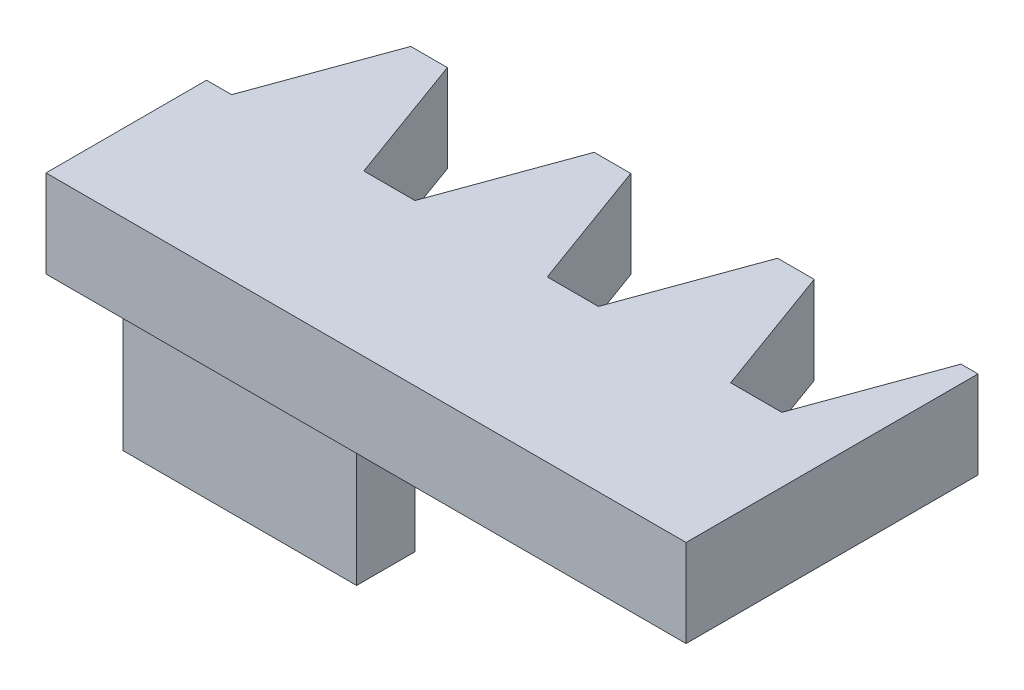
ISO-10303-21;
HEADER;
FILE_DESCRIPTION(('STEP AP214'),'2;1');
FILE_NAME('part.step','',(''),(''),'','','');
FILE_SCHEMA(('AUTOMOTIVE_DESIGN { 1 0 10303 214 1 1 1 1 }'));
ENDSEC;
DATA;
#1=APPLICATION_CONTEXT('core data for automotive mechanical design processes');
#2=APPLICATION_PROTOCOL_DEFINITION('international standard','automotive_design',2000,#1);
#3=PRODUCT_CONTEXT('',#1,'mechanical');
#4=PRODUCT('Part','Part','',(#3));
#5=PRODUCT_RELATED_PRODUCT_CATEGORY('part','',(#4));
#6=PRODUCT_DEFINITION_FORMATION('','',#4);
#7=PRODUCT_DEFINITION_CONTEXT('part definition',#1,'design');
#8=PRODUCT_DEFINITION('design','',#6,#7);
#9=PRODUCT_DEFINITION_SHAPE('','',#8);
#10=(LENGTH_UNIT() NAMED_UNIT(*) SI_UNIT(.MILLI.,.METRE.));
#11=(NAMED_UNIT(*) PLANE_ANGLE_UNIT() SI_UNIT($,.RADIAN.));
#12=(NAMED_UNIT(*) SI_UNIT($,.STERADIAN.) SOLID_ANGLE_UNIT());
#13=UNCERTAINTY_MEASURE_WITH_UNIT(LENGTH_MEASURE(1.E-05),#10,'distance_accuracy_value','');
#14=(GEOMETRIC_REPRESENTATION_CONTEXT(3) GLOBAL_UNCERTAINTY_ASSIGNED_CONTEXT((#13)) GLOBAL_UNIT_ASSIGNED_CONTEXT((#10,
#11,#12)) REPRESENTATION_CONTEXT('',''));
#15=CARTESIAN_POINT('',(0.,0.,0.));
#16=DIRECTION('',(0.,0.,1.));
#17=DIRECTION('',(1.,0.,0.));
#18=AXIS2_PLACEMENT_3D('',#15,#16,#17);
#19=CARTESIAN_POINT('',(0.,12.7,0.));
#20=DIRECTION('',(-1.,0.,0.));
#21=DIRECTION('',(0.,0.,-1.));
#22=AXIS2_PLACEMENT_3D('',#19,#20,#21);
#23=PLANE('',#22);
#24=DIRECTION('',(0.,0.,1.));
#25=VECTOR('',#24,1.);
#26=CARTESIAN_POINT('',(0.,0.,0.));
#27=LINE('',#26,#25);
#28=CARTESIAN_POINT('',(0.,0.,-6.35));
#29=VERTEX_POINT('',#28);
#30=CARTESIAN_POINT('',(0.,0.,0.));
#31=VERTEX_POINT('',#30);
#32=EDGE_CURVE('E334',#29,#31,#27,.T.);
#33=ORIENTED_EDGE('',*,*,#32,.F.);
#34=DIRECTION('',(0.,-1.,0.));
#35=VECTOR('',#34,1.);
#36=CARTESIAN_POINT('',(0.,12.7,-6.35));
#37=LINE('',#36,#35);
#38=CARTESIAN_POINT('',(0.,12.7,-6.35));
#39=VERTEX_POINT('',#38);
#40=EDGE_CURVE('E343',#39,#29,#37,.T.);
#41=ORIENTED_EDGE('',*,*,#40,.F.);
#42=DIRECTION('',(0.,0.,1.));
#43=VECTOR('',#42,1.);
#44=CARTESIAN_POINT('',(0.,12.7,0.));
#45=LINE('',#44,#43);
#46=CARTESIAN_POINT('',(0.,12.7,0.));
#47=VERTEX_POINT('',#46);
#48=EDGE_CURVE('E335',#39,#47,#45,.T.);
#49=ORIENTED_EDGE('',*,*,#48,.T.);
#50=DIRECTION('',(0.,-1.,0.));
#51=VECTOR('',#50,1.);
#52=CARTESIAN_POINT('',(0.,12.7,0.));
#53=LINE('',#52,#51);
#54=EDGE_CURVE('E11',#47,#31,#53,.T.);
#55=ORIENTED_EDGE('',*,*,#54,.T.);
#56=EDGE_LOOP('',(#33,#41,#49,#55));
#57=FACE_BOUND('',#56,.T.);
#58=ADVANCED_FACE('F41',(#57),#23,.F.);
#59=CARTESIAN_POINT('',(0.,12.7,0.));
#60=DIRECTION('',(0.,0.,-1.));
#61=DIRECTION('',(1.,0.,0.));
#62=AXIS2_PLACEMENT_3D('',#59,#60,#61);
#63=PLANE('',#62);
#64=DIRECTION('',(-1.,0.,0.));
#65=VECTOR('',#64,1.);
#66=CARTESIAN_POINT('',(0.,0.,0.));
#67=LINE('',#66,#65);
#68=CARTESIAN_POINT('',(-25.4,0.,0.));
#69=VERTEX_POINT('',#68);
#70=EDGE_CURVE('E345',#31,#69,#67,.T.);
#71=ORIENTED_EDGE('',*,*,#70,.F.);
#72=ORIENTED_EDGE('',*,*,#54,.F.);
#73=DIRECTION('',(-1.,0.,0.));
#74=VECTOR('',#73,1.);
#75=CARTESIAN_POINT('',(0.,12.7,0.));
#76=LINE('',#75,#74);
#77=CARTESIAN_POINT('',(-25.4,12.7,0.));
#78=VERTEX_POINT('',#77);
#79=EDGE_CURVE('E88',#47,#78,#76,.T.);
#80=ORIENTED_EDGE('',*,*,#79,.T.);
#81=DIRECTION('',(0.,-1.,0.));
#82=VECTOR('',#81,1.);
#83=CARTESIAN_POINT('',(-25.4,12.7,0.));
#84=LINE('',#83,#82);
#85=EDGE_CURVE('E48',#78,#69,#84,.T.);
#86=ORIENTED_EDGE('',*,*,#85,.T.);
#87=EDGE_LOOP('',(#71,#72,#80,#86));
#88=FACE_BOUND('',#87,.T.);
#89=ADVANCED_FACE('F357',(#88),#63,.F.);
#90=CARTESIAN_POINT('',(-25.4,12.7,0.));
#91=DIRECTION('',(1.,0.,0.));
#92=DIRECTION('',(0.,0.,1.));
#93=AXIS2_PLACEMENT_3D('',#90,#91,#92);
#94=PLANE('',#93);
#95=DIRECTION('',(0.,0.,-1.));
#96=VECTOR('',#95,1.);
#97=CARTESIAN_POINT('',(-25.4,0.,0.));
#98=LINE('',#97,#96);
#99=CARTESIAN_POINT('',(-25.4,0.,-6.35));
#100=VERTEX_POINT('',#99);
#101=EDGE_CURVE('E348',#69,#100,#98,.T.);
#102=ORIENTED_EDGE('',*,*,#101,.F.);
#103=ORIENTED_EDGE('',*,*,#85,.F.);
#104=DIRECTION('',(0.,0.,-1.));
#105=VECTOR('',#104,1.);
#106=CARTESIAN_POINT('',(-25.4,12.7,0.));
#107=LINE('',#106,#105);
#108=CARTESIAN_POINT('',(-25.4,12.7,-6.35));
#109=VERTEX_POINT('',#108);
#110=EDGE_CURVE('E339',#78,#109,#107,.T.);
#111=ORIENTED_EDGE('',*,*,#110,.T.);
#112=DIRECTION('',(0.,-1.,0.));
#113=VECTOR('',#112,1.);
#114=CARTESIAN_POINT('',(-25.4,12.7,-6.35));
#115=LINE('',#114,#113);
#116=EDGE_CURVE('E352',#109,#100,#115,.T.);
#117=ORIENTED_EDGE('',*,*,#116,.T.);
#118=EDGE_LOOP('',(#102,#103,#111,#117));
#119=FACE_BOUND('',#118,.T.);
#120=ADVANCED_FACE('F380',(#119),#94,.F.);
#121=CARTESIAN_POINT('',(0.,12.7,-6.35));
#122=DIRECTION('',(0.,0.,1.));
#123=DIRECTION('',(-1.,0.,0.));
#124=AXIS2_PLACEMENT_3D('',#121,#122,#123);
#125=PLANE('',#124);
#126=DIRECTION('',(1.,0.,0.));
#127=VECTOR('',#126,1.);
#128=CARTESIAN_POINT('',(0.,0.,-6.35));
#129=LINE('',#128,#127);
#130=EDGE_CURVE('E84',#100,#29,#129,.T.);
#131=ORIENTED_EDGE('',*,*,#130,.F.);
#132=ORIENTED_EDGE('',*,*,#116,.F.);
#133=DIRECTION('',(1.,0.,0.));
#134=VECTOR('',#133,1.);
#135=CARTESIAN_POINT('',(0.,12.7,-6.35));
#136=LINE('',#135,#134);
#137=EDGE_CURVE('E64',#109,#39,#136,.T.);
#138=ORIENTED_EDGE('',*,*,#137,.T.);
#139=ORIENTED_EDGE('',*,*,#40,.T.);
#140=EDGE_LOOP('',(#131,#132,#138,#139));
#141=FACE_BOUND('',#140,.T.);
#142=ADVANCED_FACE('F384',(#141),#125,.F.);
#143=CARTESIAN_POINT('',(0.,0.,0.));
#144=DIRECTION('',(0.,-1.,0.));
#145=DIRECTION('',(0.,0.,-1.));
#146=AXIS2_PLACEMENT_3D('',#143,#144,#145);
#147=PLANE('',#146);
#148=ORIENTED_EDGE('',*,*,#32,.T.);
#149=ORIENTED_EDGE('',*,*,#70,.T.);
#150=ORIENTED_EDGE('',*,*,#101,.T.);
#151=ORIENTED_EDGE('',*,*,#130,.T.);
#152=EDGE_LOOP('',(#148,#149,#150,#151));
#153=FACE_BOUND('',#152,.T.);
#154=ADVANCED_FACE('F359',(#153),#147,.T.);
#155=CARTESIAN_POINT('',(86.106,12.7,-31.496));
#156=DIRECTION('',(0.,0.,-1.));
#157=DIRECTION('',(0.,1.,0.));
#158=AXIS2_PLACEMENT_3D('',#155,#156,#157);
#159=PLANE('',#158);
#160=DIRECTION('',(1.,0.,0.));
#161=VECTOR('',#160,1.);
#162=CARTESIAN_POINT('',(86.106,12.7,-31.496));
#163=LINE('',#162,#161);
#164=CARTESIAN_POINT('',(-5.65527731803467,12.7,-31.496));
#165=VERTEX_POINT('',#164);
#166=CARTESIAN_POINT('',(-1.67474262946535,12.7,-31.496));
#167=VERTEX_POINT('',#166);
#168=EDGE_CURVE('E332',#165,#167,#163,.T.);
#169=ORIENTED_EDGE('',*,*,#168,.F.);
#170=DIRECTION('',(0.,1.,0.));
#171=VECTOR('',#170,1.);
#172=CARTESIAN_POINT('',(-5.65527731803467,12.7,-31.496));
#173=LINE('',#172,#171);
#174=CARTESIAN_POINT('',(-5.65527731803467,22.225,-31.496));
#175=VERTEX_POINT('',#174);
#176=EDGE_CURVE('E286',#165,#175,#173,.T.);
#177=ORIENTED_EDGE('',*,*,#176,.T.);
#178=DIRECTION('',(1.,0.,0.));
#179=VECTOR('',#178,1.);
#180=CARTESIAN_POINT('',(86.106,22.225,-31.496));
#181=LINE('',#180,#179);
#182=CARTESIAN_POINT('',(-1.67474262946535,22.225,-31.496));
#183=VERTEX_POINT('',#182);
#184=EDGE_CURVE('E247',#175,#183,#181,.T.);
#185=ORIENTED_EDGE('',*,*,#184,.T.);
#186=DIRECTION('',(0.,-1.,0.));
#187=VECTOR('',#186,1.);
#188=CARTESIAN_POINT('',(-1.67474262946535,12.7,-31.496));
#189=LINE('',#188,#187);
#190=EDGE_CURVE('E301',#183,#167,#189,.T.);
#191=ORIENTED_EDGE('',*,*,#190,.T.);
#192=EDGE_LOOP('',(#169,#177,#185,#191));
#193=FACE_BOUND('',#192,.T.);
#194=ADVANCED_FACE('F391',(#193),#159,.T.);
#195=CARTESIAN_POINT('',(14.2938360094653,12.7,-31.496));
#196=VERTEX_POINT('',#195);
#197=CARTESIAN_POINT('',(18.2743706980347,12.7,-31.496));
#198=VERTEX_POINT('',#197);
#199=EDGE_CURVE('E417',#196,#198,#163,.T.);
#200=ORIENTED_EDGE('',*,*,#199,.F.);
#201=DIRECTION('',(0.,1.,0.));
#202=VECTOR('',#201,1.);
#203=CARTESIAN_POINT('',(14.2938360094653,12.7,-31.496));
#204=LINE('',#203,#202);
#205=CARTESIAN_POINT('',(14.2938360094653,22.225,-31.496));
#206=VERTEX_POINT('',#205);
#207=EDGE_CURVE('E306',#196,#206,#204,.T.);
#208=ORIENTED_EDGE('',*,*,#207,.T.);
#209=CARTESIAN_POINT('',(18.2743706980347,22.225,-31.496));
#210=VERTEX_POINT('',#209);
#211=EDGE_CURVE('E427',#206,#210,#181,.T.);
#212=ORIENTED_EDGE('',*,*,#211,.T.);
#213=DIRECTION('',(0.,-1.,0.));
#214=VECTOR('',#213,1.);
#215=CARTESIAN_POINT('',(18.2743706980347,12.7,-31.496));
#216=LINE('',#215,#214);
#217=EDGE_CURVE('E321',#210,#198,#216,.T.);
#218=ORIENTED_EDGE('',*,*,#217,.T.);
#219=EDGE_LOOP('',(#200,#208,#212,#218));
#220=FACE_BOUND('',#219,.T.);
#221=ADVANCED_FACE('F402',(#220),#159,.T.);
#222=DIRECTION('',(0.,-1.,0.));
#223=VECTOR('',#222,1.);
#224=CARTESIAN_POINT('',(36.0885245413045,12.7,-31.496));
#225=LINE('',#224,#223);
#226=CARTESIAN_POINT('',(36.0885245413045,22.225,-31.496));
#227=VERTEX_POINT('',#226);
#228=CARTESIAN_POINT('',(36.0885245413045,12.7,-31.496));
#229=VERTEX_POINT('',#228);
#230=EDGE_CURVE('E206',#227,#229,#225,.T.);
#231=ORIENTED_EDGE('',*,*,#230,.T.);
#232=CARTESIAN_POINT('',(34.2429493369653,12.7,-31.496));
#233=VERTEX_POINT('',#232);
#234=EDGE_CURVE('E204',#233,#229,#163,.T.);
#235=ORIENTED_EDGE('',*,*,#234,.F.);
#236=DIRECTION('',(0.,1.,0.));
#237=VECTOR('',#236,1.);
#238=CARTESIAN_POINT('',(34.2429493369653,12.7,-31.496));
#239=LINE('',#238,#237);
#240=CARTESIAN_POINT('',(34.2429493369653,22.225,-31.496));
#241=VERTEX_POINT('',#240);
#242=EDGE_CURVE('E216',#233,#241,#239,.T.);
#243=ORIENTED_EDGE('',*,*,#242,.T.);
#244=EDGE_CURVE('E242',#241,#227,#181,.T.);
#245=ORIENTED_EDGE('',*,*,#244,.T.);
#246=EDGE_LOOP('',(#231,#235,#243,#245));
#247=FACE_BOUND('',#246,.T.);
#248=ADVANCED_FACE('F397',(#247),#159,.T.);
#249=CARTESIAN_POINT('',(-25.6043906455347,12.7,-31.496));
#250=VERTEX_POINT('',#249);
#251=CARTESIAN_POINT('',(-21.6238559569653,12.7,-31.496));
#252=VERTEX_POINT('',#251);
#253=EDGE_CURVE('E329',#250,#252,#163,.T.);
#254=ORIENTED_EDGE('',*,*,#253,.F.);
#255=DIRECTION('',(0.,1.,0.));
#256=VECTOR('',#255,1.);
#257=CARTESIAN_POINT('',(-25.6043906455347,12.7,-31.496));
#258=LINE('',#257,#256);
#259=CARTESIAN_POINT('',(-25.6043906455347,22.225,-31.496));
#260=VERTEX_POINT('',#259);
#261=EDGE_CURVE('E266',#250,#260,#258,.T.);
#262=ORIENTED_EDGE('',*,*,#261,.T.);
#263=CARTESIAN_POINT('',(-21.6238559569653,22.225,-31.496));
#264=VERTEX_POINT('',#263);
#265=EDGE_CURVE('E243',#260,#264,#181,.T.);
#266=ORIENTED_EDGE('',*,*,#265,.T.);
#267=DIRECTION('',(0.,-1.,0.));
#268=VECTOR('',#267,1.);
#269=CARTESIAN_POINT('',(-21.6238559569653,12.7,-31.496));
#270=LINE('',#269,#268);
#271=EDGE_CURVE('E281',#264,#252,#270,.T.);
#272=ORIENTED_EDGE('',*,*,#271,.T.);
#273=EDGE_LOOP('',(#254,#262,#266,#272));
#274=FACE_BOUND('',#273,.T.);
#275=ADVANCED_FACE('F394',(#274),#159,.T.);
#276=CARTESIAN_POINT('',(-33.528,12.7,0.253999999999999));
#277=DIRECTION('',(-1.,0.,0.));
#278=DIRECTION('',(0.,-1.,0.));
#279=AXIS2_PLACEMENT_3D('',#276,#277,#278);
#280=PLANE('',#279);
#281=DIRECTION('',(0.,0.,-1.));
#282=VECTOR('',#281,1.);
#283=CARTESIAN_POINT('',(-33.528,12.7,0.253999999999999));
#284=LINE('',#283,#282);
#285=CARTESIAN_POINT('',(-33.528,12.7,0.253999999999999));
#286=VERTEX_POINT('',#285);
#287=CARTESIAN_POINT('',(-33.528,12.7,-17.2085));
#288=VERTEX_POINT('',#287);
#289=EDGE_CURVE('E215',#286,#288,#284,.T.);
#290=ORIENTED_EDGE('',*,*,#289,.F.);
#291=DIRECTION('',(0.,1.,0.));
#292=VECTOR('',#291,1.);
#293=CARTESIAN_POINT('',(-33.528,12.7,0.253999999999999));
#294=LINE('',#293,#292);
#295=CARTESIAN_POINT('',(-33.528,22.225,0.254000000000001));
#296=VERTEX_POINT('',#295);
#297=EDGE_CURVE('E213',#286,#296,#294,.T.);
#298=ORIENTED_EDGE('',*,*,#297,.T.);
#299=DIRECTION('',(0.,0.,-1.));
#300=VECTOR('',#299,1.);
#301=CARTESIAN_POINT('',(-33.528,22.225,0.254000000000001));
#302=LINE('',#301,#300);
#303=CARTESIAN_POINT('',(-33.528,22.225,-17.2085));
#304=VERTEX_POINT('',#303);
#305=EDGE_CURVE('E239',#296,#304,#302,.T.);
#306=ORIENTED_EDGE('',*,*,#305,.T.);
#307=DIRECTION('',(0.,-1.,0.));
#308=VECTOR('',#307,1.);
#309=CARTESIAN_POINT('',(-33.528,12.7,-17.2085));
#310=LINE('',#309,#308);
#311=EDGE_CURVE('E263',#304,#288,#310,.T.);
#312=ORIENTED_EDGE('',*,*,#311,.T.);
#313=EDGE_LOOP('',(#290,#298,#306,#312));
#314=FACE_BOUND('',#313,.T.);
#315=ADVANCED_FACE('F373',(#314),#280,.T.);
#316=CARTESIAN_POINT('',(86.106,12.7,0.253999999999999));
#317=DIRECTION('',(0.,0.,1.));
#318=DIRECTION('',(0.,-1.,0.));
#319=AXIS2_PLACEMENT_3D('',#316,#317,#318);
#320=PLANE('',#319);
#321=DIRECTION('',(0.,1.,0.));
#322=VECTOR('',#321,1.);
#323=CARTESIAN_POINT('',(36.0885245413045,0.,0.253999999999998));
#324=LINE('',#323,#322);
#325=CARTESIAN_POINT('',(36.0885245413045,12.7,0.254));
#326=VERTEX_POINT('',#325);
#327=CARTESIAN_POINT('',(36.0885245413045,22.225,0.254000000000001));
#328=VERTEX_POINT('',#327);
#329=EDGE_CURVE('E207',#326,#328,#324,.T.);
#330=ORIENTED_EDGE('',*,*,#329,.T.);
#331=DIRECTION('',(-1.,0.,0.));
#332=VECTOR('',#331,1.);
#333=CARTESIAN_POINT('',(86.106,22.225,0.254000000000001));
#334=LINE('',#333,#332);
#335=EDGE_CURVE('E237',#328,#296,#334,.T.);
#336=ORIENTED_EDGE('',*,*,#335,.T.);
#337=ORIENTED_EDGE('',*,*,#297,.F.);
#338=DIRECTION('',(-1.,0.,0.));
#339=VECTOR('',#338,1.);
#340=CARTESIAN_POINT('',(86.106,12.7,0.253999999999999));
#341=LINE('',#340,#339);
#342=EDGE_CURVE('E201',#326,#286,#341,.T.);
#343=ORIENTED_EDGE('',*,*,#342,.F.);
#344=EDGE_LOOP('',(#330,#336,#337,#343));
#345=FACE_BOUND('',#344,.T.);
#346=ADVANCED_FACE('F211',(#345),#320,.T.);
#347=CARTESIAN_POINT('',(86.106,12.7,-31.496));
#348=DIRECTION('',(0.,-1.,0.));
#349=DIRECTION('',(1.,0.,0.));
#350=AXIS2_PLACEMENT_3D('',#347,#348,#349);
#351=PLANE('',#350);
#352=DIRECTION('',(0.,0.,1.));
#353=VECTOR('',#352,1.);
#354=CARTESIAN_POINT('',(36.0885245413045,12.7,-31.496));
#355=LINE('',#354,#353);
#356=EDGE_CURVE('E197',#229,#326,#355,.T.);
#357=ORIENTED_EDGE('',*,*,#356,.T.);
#358=ORIENTED_EDGE('',*,*,#342,.T.);
#359=ORIENTED_EDGE('',*,*,#289,.T.);
#360=DIRECTION('',(-1.,0.,0.));
#361=VECTOR('',#360,1.);
#362=CARTESIAN_POINT('',(-36.3727445623871,12.7,-17.2085));
#363=LINE('',#362,#361);
#364=CARTESIAN_POINT('',(-30.8046153676129,12.7,-17.2085));
#365=VERTEX_POINT('',#364);
#366=EDGE_CURVE('E258',#365,#288,#363,.T.);
#367=ORIENTED_EDGE('',*,*,#366,.F.);
#368=DIRECTION('',(-0.342020143325663,0.,0.939692620785911));
#369=VECTOR('',#368,1.);
#370=CARTESIAN_POINT('',(-25.5951458015843,12.7,-31.5214));
#371=LINE('',#370,#369);
#372=EDGE_CURVE('E255',#250,#365,#371,.T.);
#373=ORIENTED_EDGE('',*,*,#372,.F.);
#374=ORIENTED_EDGE('',*,*,#253,.T.);
#375=DIRECTION('',(-0.342020143325663,0.,-0.939692620785911));
#376=VECTOR('',#375,1.);
#377=CARTESIAN_POINT('',(-21.6331008009157,12.7,-31.5214));
#378=LINE('',#377,#376);
#379=CARTESIAN_POINT('',(-16.4236312348871,12.7,-17.2085));
#380=VERTEX_POINT('',#379);
#381=EDGE_CURVE('E275',#380,#252,#378,.T.);
#382=ORIENTED_EDGE('',*,*,#381,.F.);
#383=DIRECTION('',(-1.,0.,0.));
#384=VECTOR('',#383,1.);
#385=CARTESIAN_POINT('',(-16.4236312348871,12.7,-17.2085));
#386=LINE('',#385,#384);
#387=CARTESIAN_POINT('',(-10.8555020401129,12.7,-17.2085));
#388=VERTEX_POINT('',#387);
#389=EDGE_CURVE('E272',#388,#380,#386,.T.);
#390=ORIENTED_EDGE('',*,*,#389,.F.);
#391=DIRECTION('',(-0.342020143325663,0.,0.939692620785911));
#392=VECTOR('',#391,1.);
#393=CARTESIAN_POINT('',(-5.64603247408432,12.7,-31.5214));
#394=LINE('',#393,#392);
#395=EDGE_CURVE('E269',#165,#388,#394,.T.);
#396=ORIENTED_EDGE('',*,*,#395,.F.);
#397=ORIENTED_EDGE('',*,*,#168,.T.);
#398=DIRECTION('',(-0.342020143325663,0.,-0.939692620785911));
#399=VECTOR('',#398,1.);
#400=CARTESIAN_POINT('',(-1.68398747341569,12.7,-31.5214));
#401=LINE('',#400,#399);
#402=CARTESIAN_POINT('',(3.52548209261291,12.7,-17.2085));
#403=VERTEX_POINT('',#402);
#404=EDGE_CURVE('E295',#403,#167,#401,.T.);
#405=ORIENTED_EDGE('',*,*,#404,.F.);
#406=DIRECTION('',(-1.,0.,0.));
#407=VECTOR('',#406,1.);
#408=CARTESIAN_POINT('',(3.52548209261291,12.7,-17.2085));
#409=LINE('',#408,#407);
#410=CARTESIAN_POINT('',(9.09361128738706,12.7,-17.2085));
#411=VERTEX_POINT('',#410);
#412=EDGE_CURVE('E292',#411,#403,#409,.T.);
#413=ORIENTED_EDGE('',*,*,#412,.F.);
#414=DIRECTION('',(-0.342020143325663,0.,0.939692620785911));
#415=VECTOR('',#414,1.);
#416=CARTESIAN_POINT('',(14.3030808534157,12.7,-31.5214));
#417=LINE('',#416,#415);
#418=EDGE_CURVE('E289',#196,#411,#417,.T.);
#419=ORIENTED_EDGE('',*,*,#418,.F.);
#420=ORIENTED_EDGE('',*,*,#199,.T.);
#421=DIRECTION('',(-0.342020143325663,0.,-0.939692620785911));
#422=VECTOR('',#421,1.);
#423=CARTESIAN_POINT('',(18.2651258540843,12.7,-31.5214));
#424=LINE('',#423,#422);
#425=CARTESIAN_POINT('',(23.4745954201129,12.7,-17.2085));
#426=VERTEX_POINT('',#425);
#427=EDGE_CURVE('E315',#426,#198,#424,.T.);
#428=ORIENTED_EDGE('',*,*,#427,.F.);
#429=DIRECTION('',(-1.,0.,0.));
#430=VECTOR('',#429,1.);
#431=CARTESIAN_POINT('',(23.4745954201129,12.7,-17.2085));
#432=LINE('',#431,#430);
#433=CARTESIAN_POINT('',(29.0427246148871,12.7,-17.2085));
#434=VERTEX_POINT('',#433);
#435=EDGE_CURVE('E312',#434,#426,#432,.T.);
#436=ORIENTED_EDGE('',*,*,#435,.F.);
#437=DIRECTION('',(-0.342020143325663,0.,0.939692620785911));
#438=VECTOR('',#437,1.);
#439=CARTESIAN_POINT('',(34.2521941809157,12.7,-31.5214));
#440=LINE('',#439,#438);
#441=EDGE_CURVE('E309',#233,#434,#440,.T.);
#442=ORIENTED_EDGE('',*,*,#441,.F.);
#443=ORIENTED_EDGE('',*,*,#234,.T.);
#444=EDGE_LOOP('',(#357,#358,#359,#367,#373,#374,#382,#390,#396,#397,#405,#413,#419,#420,#428,
#436,#442,#443));
#445=FACE_BOUND('',#444,.T.);
#446=ORIENTED_EDGE('',*,*,#137,.F.);
#447=ORIENTED_EDGE('',*,*,#110,.F.);
#448=ORIENTED_EDGE('',*,*,#79,.F.);
#449=ORIENTED_EDGE('',*,*,#48,.F.);
#450=EDGE_LOOP('',(#446,#447,#448,#449));
#451=FACE_BOUND('',#450,.T.);
#452=ADVANCED_FACE('F199',(#445,#451),#351,.T.);
#453=CARTESIAN_POINT('',(34.2521941809157,12.7,-31.5214));
#454=DIRECTION('',(0.93969262078591,0.,0.342020143325663));
#455=DIRECTION('',(-0.342020143325663,0.,0.939692620785911));
#456=AXIS2_PLACEMENT_3D('',#453,#454,#455);
#457=PLANE('',#456);
#458=ORIENTED_EDGE('',*,*,#242,.F.);
#459=ORIENTED_EDGE('',*,*,#441,.T.);
#460=DIRECTION('',(0.,1.,0.));
#461=VECTOR('',#460,1.);
#462=CARTESIAN_POINT('',(29.0427246148871,12.7,-17.2085));
#463=LINE('',#462,#461);
#464=CARTESIAN_POINT('',(29.0427246148871,22.225,-17.2085));
#465=VERTEX_POINT('',#464);
#466=EDGE_CURVE('E317',#434,#465,#463,.T.);
#467=ORIENTED_EDGE('',*,*,#466,.T.);
#468=DIRECTION('',(0.342020143325663,0.,-0.939692620785911));
#469=VECTOR('',#468,1.);
#470=CARTESIAN_POINT('',(40.3097737866746,22.225,-48.1644631833717));
#471=LINE('',#470,#469);
#472=EDGE_CURVE('E246',#465,#241,#471,.T.);
#473=ORIENTED_EDGE('',*,*,#472,.T.);
#474=EDGE_LOOP('',(#458,#459,#467,#473));
#475=FACE_BOUND('',#474,.T.);
#476=ADVANCED_FACE('F364',(#475),#457,.F.);
#477=CARTESIAN_POINT('',(18.2651258540843,12.7,-31.5214));
#478=DIRECTION('',(-0.93969262078591,0.,0.342020143325663));
#479=DIRECTION('',(-0.342020143325663,0.,-0.939692620785911));
#480=AXIS2_PLACEMENT_3D('',#477,#478,#479);
#481=PLANE('',#480);
#482=DIRECTION('',(0.,1.,0.));
#483=VECTOR('',#482,1.);
#484=CARTESIAN_POINT('',(23.4745954201129,12.7,-17.2085));
#485=LINE('',#484,#483);
#486=CARTESIAN_POINT('',(23.4745954201129,22.225,-17.2085));
#487=VERTEX_POINT('',#486);
#488=EDGE_CURVE('E318',#426,#487,#485,.T.);
#489=ORIENTED_EDGE('',*,*,#488,.F.);
#490=ORIENTED_EDGE('',*,*,#427,.T.);
#491=ORIENTED_EDGE('',*,*,#217,.F.);
#492=DIRECTION('',(-0.342020143325663,0.,-0.939692620785911));
#493=VECTOR('',#492,1.);
#494=CARTESIAN_POINT('',(18.2651258540843,22.225,-31.5214));
#495=LINE('',#494,#493);
#496=EDGE_CURVE('E235',#487,#210,#495,.T.);
#497=ORIENTED_EDGE('',*,*,#496,.F.);
#498=EDGE_LOOP('',(#489,#490,#491,#497));
#499=FACE_BOUND('',#498,.T.);
#500=ADVANCED_FACE('F370',(#499),#481,.F.);
#501=CARTESIAN_POINT('',(23.4745954201129,12.7,-17.2085));
#502=DIRECTION('',(0.,0.,1.));
#503=DIRECTION('',(0.,-1.,0.));
#504=AXIS2_PLACEMENT_3D('',#501,#502,#503);
#505=PLANE('',#504);
#506=ORIENTED_EDGE('',*,*,#466,.F.);
#507=ORIENTED_EDGE('',*,*,#435,.T.);
#508=ORIENTED_EDGE('',*,*,#488,.T.);
#509=DIRECTION('',(-1.,0.,0.));
#510=VECTOR('',#509,1.);
#511=CARTESIAN_POINT('',(23.4745954201129,22.225,-17.2085));
#512=LINE('',#511,#510);
#513=EDGE_CURVE('E233',#465,#487,#512,.T.);
#514=ORIENTED_EDGE('',*,*,#513,.F.);
#515=EDGE_LOOP('',(#506,#507,#508,#514));
#516=FACE_BOUND('',#515,.T.);
#517=ADVANCED_FACE('F431',(#516),#505,.F.);
#518=CARTESIAN_POINT('',(14.3030808534157,12.7,-31.5214));
#519=DIRECTION('',(0.93969262078591,0.,0.342020143325663));
#520=DIRECTION('',(-0.342020143325663,0.,0.939692620785911));
#521=AXIS2_PLACEMENT_3D('',#518,#519,#520);
#522=PLANE('',#521);
#523=ORIENTED_EDGE('',*,*,#207,.F.);
#524=ORIENTED_EDGE('',*,*,#418,.T.);
#525=DIRECTION('',(0.,1.,0.));
#526=VECTOR('',#525,1.);
#527=CARTESIAN_POINT('',(9.09361128738706,12.7,-17.2085));
#528=LINE('',#527,#526);
#529=CARTESIAN_POINT('',(9.09361128738706,22.225,-17.2085));
#530=VERTEX_POINT('',#529);
#531=EDGE_CURVE('E297',#411,#530,#528,.T.);
#532=ORIENTED_EDGE('',*,*,#531,.T.);
#533=DIRECTION('',(0.342020143325663,0.,-0.939692620785911));
#534=VECTOR('',#533,1.);
#535=CARTESIAN_POINT('',(22.6942634180834,22.225,-54.5759846189464));
#536=LINE('',#535,#534);
#537=EDGE_CURVE('E249',#530,#206,#536,.T.);
#538=ORIENTED_EDGE('',*,*,#537,.T.);
#539=EDGE_LOOP('',(#523,#524,#532,#538));
#540=FACE_BOUND('',#539,.T.);
#541=ADVANCED_FACE('F447',(#540),#522,.F.);
#542=CARTESIAN_POINT('',(-1.68398747341569,12.7,-31.5214));
#543=DIRECTION('',(-0.93969262078591,0.,0.342020143325663));
#544=DIRECTION('',(-0.342020143325663,0.,-0.939692620785911));
#545=AXIS2_PLACEMENT_3D('',#542,#543,#544);
#546=PLANE('',#545);
#547=DIRECTION('',(0.,1.,0.));
#548=VECTOR('',#547,1.);
#549=CARTESIAN_POINT('',(3.52548209261291,12.7,-17.2085));
#550=LINE('',#549,#548);
#551=CARTESIAN_POINT('',(3.52548209261291,22.225,-17.2085));
#552=VERTEX_POINT('',#551);
#553=EDGE_CURVE('E298',#403,#552,#550,.T.);
#554=ORIENTED_EDGE('',*,*,#553,.F.);
#555=ORIENTED_EDGE('',*,*,#404,.T.);
#556=ORIENTED_EDGE('',*,*,#190,.F.);
#557=DIRECTION('',(-0.342020143325663,0.,-0.939692620785911));
#558=VECTOR('',#557,1.);
#559=CARTESIAN_POINT('',(-1.68398747341569,22.225,-31.5214));
#560=LINE('',#559,#558);
#561=EDGE_CURVE('E231',#552,#183,#560,.T.);
#562=ORIENTED_EDGE('',*,*,#561,.F.);
#563=EDGE_LOOP('',(#554,#555,#556,#562));
#564=FACE_BOUND('',#563,.T.);
#565=ADVANCED_FACE('F443',(#564),#546,.F.);
#566=CARTESIAN_POINT('',(3.52548209261291,12.7,-17.2085));
#567=DIRECTION('',(0.,0.,1.));
#568=DIRECTION('',(0.,-1.,0.));
#569=AXIS2_PLACEMENT_3D('',#566,#567,#568);
#570=PLANE('',#569);
#571=ORIENTED_EDGE('',*,*,#531,.F.);
#572=ORIENTED_EDGE('',*,*,#412,.T.);
#573=ORIENTED_EDGE('',*,*,#553,.T.);
#574=DIRECTION('',(-1.,0.,0.));
#575=VECTOR('',#574,1.);
#576=CARTESIAN_POINT('',(3.52548209261291,22.225,-17.2085));
#577=LINE('',#576,#575);
#578=EDGE_CURVE('E229',#530,#552,#577,.T.);
#579=ORIENTED_EDGE('',*,*,#578,.F.);
#580=EDGE_LOOP('',(#571,#572,#573,#579));
#581=FACE_BOUND('',#580,.T.);
#582=ADVANCED_FACE('F445',(#581),#570,.F.);
#583=CARTESIAN_POINT('',(-5.64603247408432,12.7,-31.5214));
#584=DIRECTION('',(0.93969262078591,0.,0.342020143325663));
#585=DIRECTION('',(-0.342020143325663,0.,0.939692620785911));
#586=AXIS2_PLACEMENT_3D('',#583,#584,#585);
#587=PLANE('',#586);
#588=ORIENTED_EDGE('',*,*,#176,.F.);
#589=ORIENTED_EDGE('',*,*,#395,.T.);
#590=DIRECTION('',(0.,1.,0.));
#591=VECTOR('',#590,1.);
#592=CARTESIAN_POINT('',(-10.8555020401129,12.7,-17.2085));
#593=LINE('',#592,#591);
#594=CARTESIAN_POINT('',(-10.8555020401129,22.225,-17.2085));
#595=VERTEX_POINT('',#594);
#596=EDGE_CURVE('E277',#388,#595,#593,.T.);
#597=ORIENTED_EDGE('',*,*,#596,.T.);
#598=DIRECTION('',(0.342020143325663,0.,-0.939692620785911));
#599=VECTOR('',#598,1.);
#600=CARTESIAN_POINT('',(5.07875304949229,22.225,-60.9875060545211));
#601=LINE('',#600,#599);
#602=EDGE_CURVE('E251',#595,#175,#601,.T.);
#603=ORIENTED_EDGE('',*,*,#602,.T.);
#604=EDGE_LOOP('',(#588,#589,#597,#603));
#605=FACE_BOUND('',#604,.T.);
#606=ADVANCED_FACE('F500',(#605),#587,.F.);
#607=CARTESIAN_POINT('',(-21.6331008009157,12.7,-31.5214));
#608=DIRECTION('',(-0.93969262078591,0.,0.342020143325663));
#609=DIRECTION('',(-0.342020143325663,0.,-0.939692620785911));
#610=AXIS2_PLACEMENT_3D('',#607,#608,#609);
#611=PLANE('',#610);
#612=DIRECTION('',(0.,1.,0.));
#613=VECTOR('',#612,1.);
#614=CARTESIAN_POINT('',(-16.4236312348871,12.7,-17.2085));
#615=LINE('',#614,#613);
#616=CARTESIAN_POINT('',(-16.4236312348871,22.225,-17.2085));
#617=VERTEX_POINT('',#616);
#618=EDGE_CURVE('E278',#380,#617,#615,.T.);
#619=ORIENTED_EDGE('',*,*,#618,.F.);
#620=ORIENTED_EDGE('',*,*,#381,.T.);
#621=ORIENTED_EDGE('',*,*,#271,.F.);
#622=DIRECTION('',(-0.342020143325663,0.,-0.939692620785911));
#623=VECTOR('',#622,1.);
#624=CARTESIAN_POINT('',(-21.6331008009157,22.225,-31.5214));
#625=LINE('',#624,#623);
#626=EDGE_CURVE('E227',#617,#264,#625,.T.);
#627=ORIENTED_EDGE('',*,*,#626,.F.);
#628=EDGE_LOOP('',(#619,#620,#621,#627));
#629=FACE_BOUND('',#628,.T.);
#630=ADVANCED_FACE('F511',(#629),#611,.F.);
#631=CARTESIAN_POINT('',(-16.4236312348871,12.7,-17.2085));
#632=DIRECTION('',(0.,0.,1.));
#633=DIRECTION('',(0.,-1.,0.));
#634=AXIS2_PLACEMENT_3D('',#631,#632,#633);
#635=PLANE('',#634);
#636=ORIENTED_EDGE('',*,*,#596,.F.);
#637=ORIENTED_EDGE('',*,*,#389,.T.);
#638=ORIENTED_EDGE('',*,*,#618,.T.);
#639=DIRECTION('',(-1.,0.,0.));
#640=VECTOR('',#639,1.);
#641=CARTESIAN_POINT('',(-16.4236312348871,22.225,-17.2085));
#642=LINE('',#641,#640);
#643=EDGE_CURVE('E225',#595,#617,#642,.T.);
#644=ORIENTED_EDGE('',*,*,#643,.F.);
#645=EDGE_LOOP('',(#636,#637,#638,#644));
#646=FACE_BOUND('',#645,.T.);
#647=ADVANCED_FACE('F526',(#646),#635,.F.);
#648=CARTESIAN_POINT('',(-25.5951458015843,12.7,-31.5214));
#649=DIRECTION('',(0.93969262078591,0.,0.342020143325663));
#650=DIRECTION('',(-0.342020143325663,0.,0.939692620785911));
#651=AXIS2_PLACEMENT_3D('',#648,#649,#650);
#652=PLANE('',#651);
#653=ORIENTED_EDGE('',*,*,#261,.F.);
#654=ORIENTED_EDGE('',*,*,#372,.T.);
#655=DIRECTION('',(0.,1.,0.));
#656=VECTOR('',#655,1.);
#657=CARTESIAN_POINT('',(-30.8046153676129,12.7,-17.2085));
#658=LINE('',#657,#656);
#659=CARTESIAN_POINT('',(-30.8046153676129,22.225,-17.2085));
#660=VERTEX_POINT('',#659);
#661=EDGE_CURVE('E260',#365,#660,#658,.T.);
#662=ORIENTED_EDGE('',*,*,#661,.T.);
#663=DIRECTION('',(0.342020143325663,0.,-0.939692620785911));
#664=VECTOR('',#663,1.);
#665=CARTESIAN_POINT('',(-12.5367573190988,22.225,-67.3990274900958));
#666=LINE('',#665,#664);
#667=EDGE_CURVE('E253',#660,#260,#666,.T.);
#668=ORIENTED_EDGE('',*,*,#667,.T.);
#669=EDGE_LOOP('',(#653,#654,#662,#668));
#670=FACE_BOUND('',#669,.T.);
#671=ADVANCED_FACE('F540',(#670),#652,.F.);
#672=CARTESIAN_POINT('',(-36.3727445623871,12.7,-17.2085));
#673=DIRECTION('',(0.,0.,1.));
#674=DIRECTION('',(0.,-1.,0.));
#675=AXIS2_PLACEMENT_3D('',#672,#673,#674);
#676=PLANE('',#675);
#677=ORIENTED_EDGE('',*,*,#661,.F.);
#678=ORIENTED_EDGE('',*,*,#366,.T.);
#679=ORIENTED_EDGE('',*,*,#311,.F.);
#680=DIRECTION('',(-1.,0.,0.));
#681=VECTOR('',#680,1.);
#682=CARTESIAN_POINT('',(-36.3727445623871,22.225,-17.2085));
#683=LINE('',#682,#681);
#684=EDGE_CURVE('E223',#660,#304,#683,.T.);
#685=ORIENTED_EDGE('',*,*,#684,.F.);
#686=EDGE_LOOP('',(#677,#678,#679,#685));
#687=FACE_BOUND('',#686,.T.);
#688=ADVANCED_FACE('F553',(#687),#676,.F.);
#689=CARTESIAN_POINT('',(86.106,22.225,-31.496));
#690=DIRECTION('',(0.,-1.,0.));
#691=DIRECTION('',(1.,0.,0.));
#692=AXIS2_PLACEMENT_3D('',#689,#690,#691);
#693=PLANE('',#692);
#694=ORIENTED_EDGE('',*,*,#244,.F.);
#695=ORIENTED_EDGE('',*,*,#472,.F.);
#696=ORIENTED_EDGE('',*,*,#513,.T.);
#697=ORIENTED_EDGE('',*,*,#496,.T.);
#698=ORIENTED_EDGE('',*,*,#211,.F.);
#699=ORIENTED_EDGE('',*,*,#537,.F.);
#700=ORIENTED_EDGE('',*,*,#578,.T.);
#701=ORIENTED_EDGE('',*,*,#561,.T.);
#702=ORIENTED_EDGE('',*,*,#184,.F.);
#703=ORIENTED_EDGE('',*,*,#602,.F.);
#704=ORIENTED_EDGE('',*,*,#643,.T.);
#705=ORIENTED_EDGE('',*,*,#626,.T.);
#706=ORIENTED_EDGE('',*,*,#265,.F.);
#707=ORIENTED_EDGE('',*,*,#667,.F.);
#708=ORIENTED_EDGE('',*,*,#684,.T.);
#709=ORIENTED_EDGE('',*,*,#305,.F.);
#710=ORIENTED_EDGE('',*,*,#335,.F.);
#711=DIRECTION('',(0.,0.,-1.));
#712=VECTOR('',#711,1.);
#713=CARTESIAN_POINT('',(36.0885245413045,22.225,0.254000000000001));
#714=LINE('',#713,#712);
#715=EDGE_CURVE('E55',#328,#227,#714,.T.);
#716=ORIENTED_EDGE('',*,*,#715,.T.);
#717=EDGE_LOOP('',(#694,#695,#696,#697,#698,#699,#700,#701,#702,#703,#704,#705,#706,#707,#708,
#709,#710,#716));
#718=FACE_BOUND('',#717,.T.);
#719=ADVANCED_FACE('F439',(#718),#693,.F.);
#720=CARTESIAN_POINT('',(36.0885245413045,0.,0.253999999999998));
#721=DIRECTION('',(-1.,0.,0.));
#722=DIRECTION('',(0.,0.,-1.));
#723=AXIS2_PLACEMENT_3D('',#720,#721,#722);
#724=PLANE('',#723);
#725=ORIENTED_EDGE('',*,*,#230,.F.);
#726=ORIENTED_EDGE('',*,*,#715,.F.);
#727=ORIENTED_EDGE('',*,*,#329,.F.);
#728=ORIENTED_EDGE('',*,*,#356,.F.);
#729=EDGE_LOOP('',(#725,#726,#727,#728));
#730=FACE_BOUND('',#729,.T.);
#731=ADVANCED_FACE('F218',(#730),#724,.F.);
#732=CLOSED_SHELL('',(#58,#89,#120,#142,#154,#194,#221,#248,#275,#315,#346,#452,#476,#500,#517,
#541,#565,#582,#606,#630,#647,#671,#688,#719,#731));
#733=MANIFOLD_SOLID_BREP('B2',#732);
#734=ADVANCED_BREP_SHAPE_REPRESENTATION('',(#18,#733),#14);
#735=SHAPE_DEFINITION_REPRESENTATION(#9,#734);
ENDSEC;
END-ISO-10303-21;
